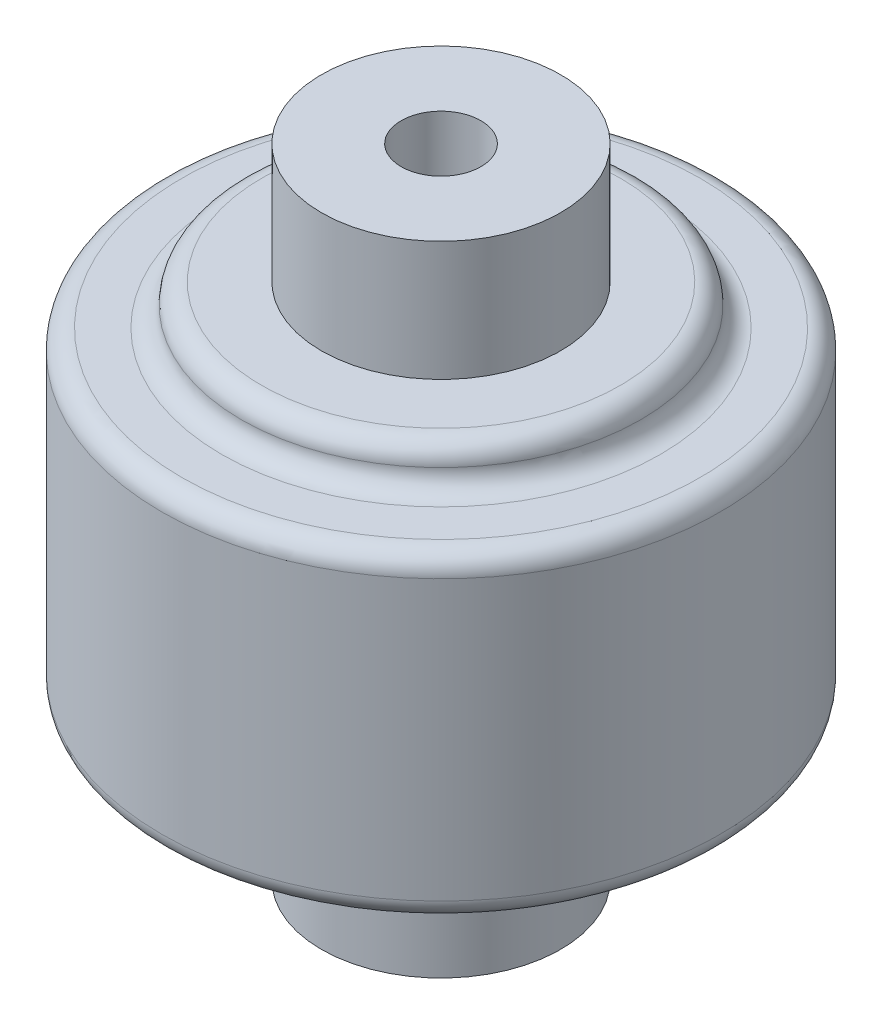
ISO-10303-21;
HEADER;
FILE_DESCRIPTION(('STEP AP214'),'2;1');
FILE_NAME('part.step','',(''),(''),'','','');
FILE_SCHEMA(('AUTOMOTIVE_DESIGN { 1 0 10303 214 1 1 1 1 }'));
ENDSEC;
DATA;
#1=APPLICATION_CONTEXT('core data for automotive mechanical design processes');
#2=APPLICATION_PROTOCOL_DEFINITION('international standard','automotive_design',2000,#1);
#3=PRODUCT_CONTEXT('',#1,'mechanical');
#4=PRODUCT('Part','Part','',(#3));
#5=PRODUCT_RELATED_PRODUCT_CATEGORY('part','',(#4));
#6=PRODUCT_DEFINITION_FORMATION('','',#4);
#7=PRODUCT_DEFINITION_CONTEXT('part definition',#1,'design');
#8=PRODUCT_DEFINITION('design','',#6,#7);
#9=PRODUCT_DEFINITION_SHAPE('','',#8);
#10=(LENGTH_UNIT() NAMED_UNIT(*) SI_UNIT(.MILLI.,.METRE.));
#11=(NAMED_UNIT(*) PLANE_ANGLE_UNIT() SI_UNIT($,.RADIAN.));
#12=(NAMED_UNIT(*) SI_UNIT($,.STERADIAN.) SOLID_ANGLE_UNIT());
#13=UNCERTAINTY_MEASURE_WITH_UNIT(LENGTH_MEASURE(1.E-05),#10,'distance_accuracy_value','');
#14=(GEOMETRIC_REPRESENTATION_CONTEXT(3) GLOBAL_UNCERTAINTY_ASSIGNED_CONTEXT((#13)) GLOBAL_UNIT_ASSIGNED_CONTEXT((#10,
#11,#12)) REPRESENTATION_CONTEXT('',''));
#15=CARTESIAN_POINT('',(0.,0.,0.));
#16=DIRECTION('',(0.,0.,1.));
#17=DIRECTION('',(1.,0.,0.));
#18=AXIS2_PLACEMENT_3D('',#15,#16,#17);
#19=CARTESIAN_POINT('',(1.5,4.,0.));
#20=DIRECTION('',(0.,-1.,0.));
#21=DIRECTION('',(0.,0.,-1.));
#22=AXIS2_PLACEMENT_3D('',#19,#20,#21);
#23=PLANE('',#22);
#24=CARTESIAN_POINT('',(0.,4.00000000000003,0.));
#25=DIRECTION('',(0.,1.,0.));
#26=DIRECTION('',(0.,0.,1.));
#27=AXIS2_PLACEMENT_3D('',#24,#25,#26);
#28=CIRCLE('',#27,0.5);
#29=CARTESIAN_POINT('',(0.,4.00000000000003,0.500000000000028));
#30=VERTEX_POINT('',#29);
#31=EDGE_CURVE('E65',#30,#30,#28,.T.);
#32=ORIENTED_EDGE('',*,*,#31,.F.);
#33=EDGE_LOOP('',(#32));
#34=FACE_BOUND('',#33,.T.);
#35=CARTESIAN_POINT('',(0.,4.00000000000003,0.));
#36=DIRECTION('',(0.,1.,0.));
#37=DIRECTION('',(0.,0.,1.));
#38=AXIS2_PLACEMENT_3D('',#35,#36,#37);
#39=CIRCLE('',#38,1.5);
#40=CARTESIAN_POINT('',(0.,4.00000000000003,1.50000000000003));
#41=VERTEX_POINT('',#40);
#42=EDGE_CURVE('E81',#41,#41,#39,.T.);
#43=ORIENTED_EDGE('',*,*,#42,.T.);
#44=EDGE_LOOP('',(#43));
#45=FACE_BOUND('',#44,.T.);
#46=ADVANCED_FACE('F36',(#34,#45),#23,.F.);
#47=CARTESIAN_POINT('',(0.,4.00000000000003,0.));
#48=DIRECTION('',(0.,1.,0.));
#49=DIRECTION('',(0.,0.,1.));
#50=AXIS2_PLACEMENT_3D('',#47,#48,#49);
#51=CYLINDRICAL_SURFACE('',#50,1.5);
#52=ORIENTED_EDGE('',*,*,#42,.F.);
#53=EDGE_LOOP('',(#52));
#54=FACE_BOUND('',#53,.T.);
#55=CARTESIAN_POINT('',(0.,2.49999999999995,0.));
#56=DIRECTION('',(0.,1.,0.));
#57=DIRECTION('',(0.,0.,1.));
#58=AXIS2_PLACEMENT_3D('',#55,#56,#57);
#59=CIRCLE('',#58,1.5);
#60=CARTESIAN_POINT('',(0.,2.49999999999995,1.5));
#61=VERTEX_POINT('',#60);
#62=EDGE_CURVE('E78',#61,#61,#59,.T.);
#63=ORIENTED_EDGE('',*,*,#62,.T.);
#64=EDGE_LOOP('',(#63));
#65=FACE_BOUND('',#64,.T.);
#66=ADVANCED_FACE('F118',(#54,#65),#51,.T.);
#67=CARTESIAN_POINT('',(2.49999999999999,2.49999999999997,0.));
#68=DIRECTION('',(0.,-1.,0.));
#69=DIRECTION('',(0.,0.,-1.));
#70=AXIS2_PLACEMENT_3D('',#67,#68,#69);
#71=PLANE('',#70);
#72=CARTESIAN_POINT('',(0.,2.49999999999995,0.));
#73=DIRECTION('',(0.,-1.,0.));
#74=DIRECTION('',(0.,0.,-1.));
#75=AXIS2_PLACEMENT_3D('',#72,#73,#74);
#76=CIRCLE('',#75,2.25);
#77=CARTESIAN_POINT('',(0.,2.49999999999995,-2.25));
#78=VERTEX_POINT('',#77);
#79=EDGE_CURVE('E84',#78,#78,#76,.F.);
#80=ORIENTED_EDGE('',*,*,#79,.T.);
#81=EDGE_LOOP('',(#80));
#82=FACE_BOUND('',#81,.T.);
#83=ORIENTED_EDGE('',*,*,#62,.F.);
#84=EDGE_LOOP('',(#83));
#85=FACE_BOUND('',#84,.T.);
#86=ADVANCED_FACE('F124',(#82,#85),#71,.F.);
#87=CARTESIAN_POINT('',(3.49999999999999,2.00000000000006,0.));
#88=DIRECTION('',(0.,-1.,0.));
#89=DIRECTION('',(0.,0.,-1.));
#90=AXIS2_PLACEMENT_3D('',#87,#88,#89);
#91=PLANE('',#90);
#92=CARTESIAN_POINT('',(0.,2.,0.));
#93=DIRECTION('',(0.,-1.,0.));
#94=DIRECTION('',(0.,0.,-1.));
#95=AXIS2_PLACEMENT_3D('',#92,#93,#94);
#96=CIRCLE('',#95,2.75);
#97=CARTESIAN_POINT('',(0.,2.,-2.74999999999999));
#98=VERTEX_POINT('',#97);
#99=EDGE_CURVE('E90',#98,#98,#96,.T.);
#100=ORIENTED_EDGE('',*,*,#99,.T.);
#101=EDGE_LOOP('',(#100));
#102=FACE_BOUND('',#101,.T.);
#103=CARTESIAN_POINT('',(0.,2.,0.));
#104=DIRECTION('',(0.,-1.,0.));
#105=DIRECTION('',(0.,0.,-1.));
#106=AXIS2_PLACEMENT_3D('',#103,#104,#105);
#107=CIRCLE('',#106,3.25);
#108=CARTESIAN_POINT('',(0.,2.,-3.24999999999999));
#109=VERTEX_POINT('',#108);
#110=EDGE_CURVE('E87',#109,#109,#107,.F.);
#111=ORIENTED_EDGE('',*,*,#110,.T.);
#112=EDGE_LOOP('',(#111));
#113=FACE_BOUND('',#112,.T.);
#114=ADVANCED_FACE('F146',(#102,#113),#91,.F.);
#115=CARTESIAN_POINT('',(0.,4.00000000000003,0.));
#116=DIRECTION('',(0.,1.,0.));
#117=DIRECTION('',(0.,0.,1.));
#118=AXIS2_PLACEMENT_3D('',#115,#116,#117);
#119=CYLINDRICAL_SURFACE('',#118,3.5);
#120=CARTESIAN_POINT('',(0.,1.74999999999997,0.));
#121=DIRECTION('',(0.,-1.,0.));
#122=DIRECTION('',(0.,0.,-1.));
#123=AXIS2_PLACEMENT_3D('',#120,#121,#122);
#124=CIRCLE('',#123,3.5);
#125=CARTESIAN_POINT('',(0.,1.74999999999997,-3.5));
#126=VERTEX_POINT('',#125);
#127=EDGE_CURVE('E96',#126,#126,#124,.T.);
#128=ORIENTED_EDGE('',*,*,#127,.T.);
#129=EDGE_LOOP('',(#128));
#130=FACE_BOUND('',#129,.T.);
#131=CARTESIAN_POINT('',(0.,-1.75000000000003,0.));
#132=DIRECTION('',(0.,1.,0.));
#133=DIRECTION('',(0.,0.,1.));
#134=AXIS2_PLACEMENT_3D('',#131,#132,#133);
#135=CIRCLE('',#134,3.5);
#136=CARTESIAN_POINT('',(0.,-1.75000000000003,3.5));
#137=VERTEX_POINT('',#136);
#138=EDGE_CURVE('E93',#137,#137,#135,.T.);
#139=ORIENTED_EDGE('',*,*,#138,.T.);
#140=EDGE_LOOP('',(#139));
#141=FACE_BOUND('',#140,.T.);
#142=ADVANCED_FACE('F148',(#130,#141),#119,.T.);
#143=CARTESIAN_POINT('',(3.49999999999999,-2.00000000000006,0.));
#144=DIRECTION('',(0.,1.,0.));
#145=DIRECTION('',(0.,0.,1.));
#146=AXIS2_PLACEMENT_3D('',#143,#144,#145);
#147=PLANE('',#146);
#148=CARTESIAN_POINT('',(0.,-1.99999999999997,0.));
#149=DIRECTION('',(0.,1.,0.));
#150=DIRECTION('',(0.,0.,1.));
#151=AXIS2_PLACEMENT_3D('',#148,#149,#150);
#152=CIRCLE('',#151,2.75);
#153=CARTESIAN_POINT('',(0.,-1.99999999999997,2.75000000000001));
#154=VERTEX_POINT('',#153);
#155=EDGE_CURVE('E10',#154,#154,#152,.T.);
#156=ORIENTED_EDGE('',*,*,#155,.T.);
#157=EDGE_LOOP('',(#156));
#158=FACE_BOUND('',#157,.T.);
#159=CARTESIAN_POINT('',(0.,-1.99999999999997,0.));
#160=DIRECTION('',(0.,1.,0.));
#161=DIRECTION('',(0.,0.,1.));
#162=AXIS2_PLACEMENT_3D('',#159,#160,#161);
#163=CIRCLE('',#162,3.25);
#164=CARTESIAN_POINT('',(0.,-1.99999999999997,3.25000000000001));
#165=VERTEX_POINT('',#164);
#166=EDGE_CURVE('E44',#165,#165,#163,.F.);
#167=ORIENTED_EDGE('',*,*,#166,.T.);
#168=EDGE_LOOP('',(#167));
#169=FACE_BOUND('',#168,.T.);
#170=ADVANCED_FACE('F155',(#158,#169),#147,.F.);
#171=CARTESIAN_POINT('',(2.49999999999999,-2.50000000000011,0.));
#172=DIRECTION('',(0.,1.,0.));
#173=DIRECTION('',(0.,0.,1.));
#174=AXIS2_PLACEMENT_3D('',#171,#172,#173);
#175=PLANE('',#174);
#176=CARTESIAN_POINT('',(0.,-2.50000000000006,0.));
#177=DIRECTION('',(0.,1.,0.));
#178=DIRECTION('',(0.,0.,1.));
#179=AXIS2_PLACEMENT_3D('',#176,#177,#178);
#180=CIRCLE('',#179,2.25);
#181=CARTESIAN_POINT('',(0.,-2.50000000000006,2.25000000000003));
#182=VERTEX_POINT('',#181);
#183=EDGE_CURVE('E49',#182,#182,#180,.F.);
#184=ORIENTED_EDGE('',*,*,#183,.T.);
#185=EDGE_LOOP('',(#184));
#186=FACE_BOUND('',#185,.T.);
#187=CARTESIAN_POINT('',(0.,-2.50000000000006,0.));
#188=DIRECTION('',(0.,1.,0.));
#189=DIRECTION('',(0.,0.,1.));
#190=AXIS2_PLACEMENT_3D('',#187,#188,#189);
#191=CIRCLE('',#190,1.5);
#192=CARTESIAN_POINT('',(0.,-2.50000000000006,1.50000000000003));
#193=VERTEX_POINT('',#192);
#194=EDGE_CURVE('E58',#193,#193,#191,.T.);
#195=ORIENTED_EDGE('',*,*,#194,.T.);
#196=EDGE_LOOP('',(#195));
#197=FACE_BOUND('',#196,.T.);
#198=ADVANCED_FACE('F101',(#186,#197),#175,.F.);
#199=CARTESIAN_POINT('',(0.,4.00000000000003,0.));
#200=DIRECTION('',(0.,1.,0.));
#201=DIRECTION('',(0.,0.,1.));
#202=AXIS2_PLACEMENT_3D('',#199,#200,#201);
#203=CYLINDRICAL_SURFACE('',#202,1.5);
#204=ORIENTED_EDGE('',*,*,#194,.F.);
#205=EDGE_LOOP('',(#204));
#206=FACE_BOUND('',#205,.T.);
#207=CARTESIAN_POINT('',(0.,-4.00000000000009,0.));
#208=DIRECTION('',(0.,1.,0.));
#209=DIRECTION('',(0.,0.,1.));
#210=AXIS2_PLACEMENT_3D('',#207,#208,#209);
#211=CIRCLE('',#210,1.5);
#212=CARTESIAN_POINT('',(0.,-4.00000000000009,1.5));
#213=VERTEX_POINT('',#212);
#214=EDGE_CURVE('E54',#213,#213,#211,.T.);
#215=ORIENTED_EDGE('',*,*,#214,.T.);
#216=EDGE_LOOP('',(#215));
#217=FACE_BOUND('',#216,.T.);
#218=ADVANCED_FACE('F164',(#206,#217),#203,.T.);
#219=CARTESIAN_POINT('',(1.49999999999999,-4.00000000000003,0.));
#220=DIRECTION('',(0.,1.,0.));
#221=DIRECTION('',(0.,0.,1.));
#222=AXIS2_PLACEMENT_3D('',#219,#220,#221);
#223=PLANE('',#222);
#224=CARTESIAN_POINT('',(0.,-4.00000000000009,0.));
#225=DIRECTION('',(0.,1.,0.));
#226=DIRECTION('',(0.,0.,1.));
#227=AXIS2_PLACEMENT_3D('',#224,#225,#226);
#228=CIRCLE('',#227,0.5);
#229=CARTESIAN_POINT('',(0.,-4.00000000000009,0.5));
#230=VERTEX_POINT('',#229);
#231=EDGE_CURVE('E73',#230,#230,#228,.T.);
#232=ORIENTED_EDGE('',*,*,#231,.T.);
#233=EDGE_LOOP('',(#232));
#234=FACE_BOUND('',#233,.T.);
#235=ORIENTED_EDGE('',*,*,#214,.F.);
#236=EDGE_LOOP('',(#235));
#237=FACE_BOUND('',#236,.T.);
#238=ADVANCED_FACE('F136',(#234,#237),#223,.F.);
#239=CARTESIAN_POINT('',(0.,2.24999999999995,0.));
#240=DIRECTION('',(0.,-1.,0.));
#241=DIRECTION('',(0.,0.,-1.));
#242=AXIS2_PLACEMENT_3D('',#239,#240,#241);
#243=TOROIDAL_SURFACE('',#242,2.75,0.25);
#244=ORIENTED_EDGE('',*,*,#99,.F.);
#245=EDGE_LOOP('',(#244));
#246=FACE_BOUND('',#245,.T.);
#247=CARTESIAN_POINT('',(0.,2.24999999999995,0.));
#248=DIRECTION('',(0.,-1.,0.));
#249=DIRECTION('',(0.,0.,-1.));
#250=AXIS2_PLACEMENT_3D('',#247,#248,#249);
#251=CIRCLE('',#250,2.5);
#252=CARTESIAN_POINT('',(0.,2.24999999999995,-2.5));
#253=VERTEX_POINT('',#252);
#254=EDGE_CURVE('E52',#253,#253,#251,.F.);
#255=ORIENTED_EDGE('',*,*,#254,.F.);
#256=EDGE_LOOP('',(#255));
#257=FACE_BOUND('',#256,.T.);
#258=ADVANCED_FACE('F134',(#246,#257),#243,.F.);
#259=CARTESIAN_POINT('',(0.,2.24999999999995,0.));
#260=DIRECTION('',(0.,-1.,0.));
#261=DIRECTION('',(0.,0.,-1.));
#262=AXIS2_PLACEMENT_3D('',#259,#260,#261);
#263=TOROIDAL_SURFACE('',#262,2.25,0.25);
#264=ORIENTED_EDGE('',*,*,#254,.T.);
#265=EDGE_LOOP('',(#264));
#266=FACE_BOUND('',#265,.T.);
#267=ORIENTED_EDGE('',*,*,#79,.F.);
#268=EDGE_LOOP('',(#267));
#269=FACE_BOUND('',#268,.T.);
#270=ADVANCED_FACE('F131',(#266,#269),#263,.T.);
#271=CARTESIAN_POINT('',(0.,1.74999999999997,0.));
#272=DIRECTION('',(0.,-1.,0.));
#273=DIRECTION('',(0.,0.,-1.));
#274=AXIS2_PLACEMENT_3D('',#271,#272,#273);
#275=TOROIDAL_SURFACE('',#274,3.25,0.25);
#276=ORIENTED_EDGE('',*,*,#127,.F.);
#277=EDGE_LOOP('',(#276));
#278=FACE_BOUND('',#277,.T.);
#279=ORIENTED_EDGE('',*,*,#110,.F.);
#280=EDGE_LOOP('',(#279));
#281=FACE_BOUND('',#280,.T.);
#282=ADVANCED_FACE('F114',(#278,#281),#275,.T.);
#283=CARTESIAN_POINT('',(0.,-2.25000000000003,0.));
#284=DIRECTION('',(0.,1.,0.));
#285=DIRECTION('',(0.,0.,1.));
#286=AXIS2_PLACEMENT_3D('',#283,#284,#285);
#287=TOROIDAL_SURFACE('',#286,2.75,0.25);
#288=ORIENTED_EDGE('',*,*,#155,.F.);
#289=EDGE_LOOP('',(#288));
#290=FACE_BOUND('',#289,.T.);
#291=CARTESIAN_POINT('',(0.,-2.25000000000003,0.));
#292=DIRECTION('',(0.,1.,0.));
#293=DIRECTION('',(0.,0.,1.));
#294=AXIS2_PLACEMENT_3D('',#291,#292,#293);
#295=CIRCLE('',#294,2.5);
#296=CARTESIAN_POINT('',(0.,-2.25000000000003,2.50000000000001));
#297=VERTEX_POINT('',#296);
#298=EDGE_CURVE('E40',#297,#297,#295,.F.);
#299=ORIENTED_EDGE('',*,*,#298,.F.);
#300=EDGE_LOOP('',(#299));
#301=FACE_BOUND('',#300,.T.);
#302=ADVANCED_FACE('F106',(#290,#301),#287,.F.);
#303=CARTESIAN_POINT('',(0.,-2.25000000000003,0.));
#304=DIRECTION('',(0.,1.,0.));
#305=DIRECTION('',(0.,0.,1.));
#306=AXIS2_PLACEMENT_3D('',#303,#304,#305);
#307=TOROIDAL_SURFACE('',#306,2.25,0.25);
#308=ORIENTED_EDGE('',*,*,#183,.F.);
#309=EDGE_LOOP('',(#308));
#310=FACE_BOUND('',#309,.T.);
#311=ORIENTED_EDGE('',*,*,#298,.T.);
#312=EDGE_LOOP('',(#311));
#313=FACE_BOUND('',#312,.T.);
#314=ADVANCED_FACE('F104',(#310,#313),#307,.T.);
#315=CARTESIAN_POINT('',(0.,-1.75000000000003,0.));
#316=DIRECTION('',(0.,1.,0.));
#317=DIRECTION('',(0.,0.,1.));
#318=AXIS2_PLACEMENT_3D('',#315,#316,#317);
#319=TOROIDAL_SURFACE('',#318,3.25,0.25);
#320=ORIENTED_EDGE('',*,*,#166,.F.);
#321=EDGE_LOOP('',(#320));
#322=FACE_BOUND('',#321,.T.);
#323=ORIENTED_EDGE('',*,*,#138,.F.);
#324=EDGE_LOOP('',(#323));
#325=FACE_BOUND('',#324,.T.);
#326=ADVANCED_FACE('F38',(#322,#325),#319,.T.);
#327=CARTESIAN_POINT('',(0.,1.49999999999997,0.));
#328=DIRECTION('',(0.,1.,0.));
#329=DIRECTION('',(0.,0.,1.));
#330=AXIS2_PLACEMENT_3D('',#327,#328,#329);
#331=CYLINDRICAL_SURFACE('',#330,0.5);
#332=CARTESIAN_POINT('',(0.,1.49999999999997,0.));
#333=DIRECTION('',(0.,1.,0.));
#334=DIRECTION('',(0.,0.,1.));
#335=AXIS2_PLACEMENT_3D('',#332,#333,#334);
#336=CIRCLE('',#335,0.5);
#337=CARTESIAN_POINT('',(0.,1.49999999999997,0.500000000000014));
#338=VERTEX_POINT('',#337);
#339=EDGE_CURVE('E61',#338,#338,#336,.T.);
#340=ORIENTED_EDGE('',*,*,#339,.F.);
#341=EDGE_LOOP('',(#340));
#342=FACE_BOUND('',#341,.T.);
#343=ORIENTED_EDGE('',*,*,#31,.T.);
#344=EDGE_LOOP('',(#343));
#345=FACE_BOUND('',#344,.T.);
#346=ADVANCED_FACE('F112',(#342,#345),#331,.F.);
#347=CARTESIAN_POINT('',(0.,1.49999999999997,0.));
#348=DIRECTION('',(0.,1.,0.));
#349=DIRECTION('',(0.,0.,1.));
#350=AXIS2_PLACEMENT_3D('',#347,#348,#349);
#351=PLANE('',#350);
#352=ORIENTED_EDGE('',*,*,#339,.T.);
#353=EDGE_LOOP('',(#352));
#354=FACE_BOUND('',#353,.T.);
#355=ADVANCED_FACE('F173',(#354),#351,.T.);
#356=CARTESIAN_POINT('',(0.,-1.50000000000003,0.));
#357=DIRECTION('',(0.,-1.,0.));
#358=DIRECTION('',(0.,0.,-1.));
#359=AXIS2_PLACEMENT_3D('',#356,#357,#358);
#360=CYLINDRICAL_SURFACE('',#359,0.5);
#361=CARTESIAN_POINT('',(0.,-1.50000000000003,0.));
#362=DIRECTION('',(0.,1.,0.));
#363=DIRECTION('',(0.,0.,1.));
#364=AXIS2_PLACEMENT_3D('',#361,#362,#363);
#365=CIRCLE('',#364,0.5);
#366=CARTESIAN_POINT('',(0.,-1.50000000000003,0.5));
#367=VERTEX_POINT('',#366);
#368=EDGE_CURVE('E70',#367,#367,#365,.T.);
#369=ORIENTED_EDGE('',*,*,#368,.T.);
#370=EDGE_LOOP('',(#369));
#371=FACE_BOUND('',#370,.T.);
#372=ORIENTED_EDGE('',*,*,#231,.F.);
#373=EDGE_LOOP('',(#372));
#374=FACE_BOUND('',#373,.T.);
#375=ADVANCED_FACE('F177',(#371,#374),#360,.F.);
#376=CARTESIAN_POINT('',(0.,-1.50000000000003,0.));
#377=DIRECTION('',(0.,-1.,0.));
#378=DIRECTION('',(0.,0.,1.));
#379=AXIS2_PLACEMENT_3D('',#376,#377,#378);
#380=PLANE('',#379);
#381=ORIENTED_EDGE('',*,*,#368,.F.);
#382=EDGE_LOOP('',(#381));
#383=FACE_BOUND('',#382,.T.);
#384=ADVANCED_FACE('F180',(#383),#380,.T.);
#385=CLOSED_SHELL('',(#46,#66,#86,#114,#142,#170,#198,#218,#238,#258,#270,#282,#302,#314,#326,
#346,#355,#375,#384));
#386=MANIFOLD_SOLID_BREP('B2',#385);
#387=ADVANCED_BREP_SHAPE_REPRESENTATION('',(#18,#386),#14);
#388=SHAPE_DEFINITION_REPRESENTATION(#9,#387);
ENDSEC;
END-ISO-10303-21;
